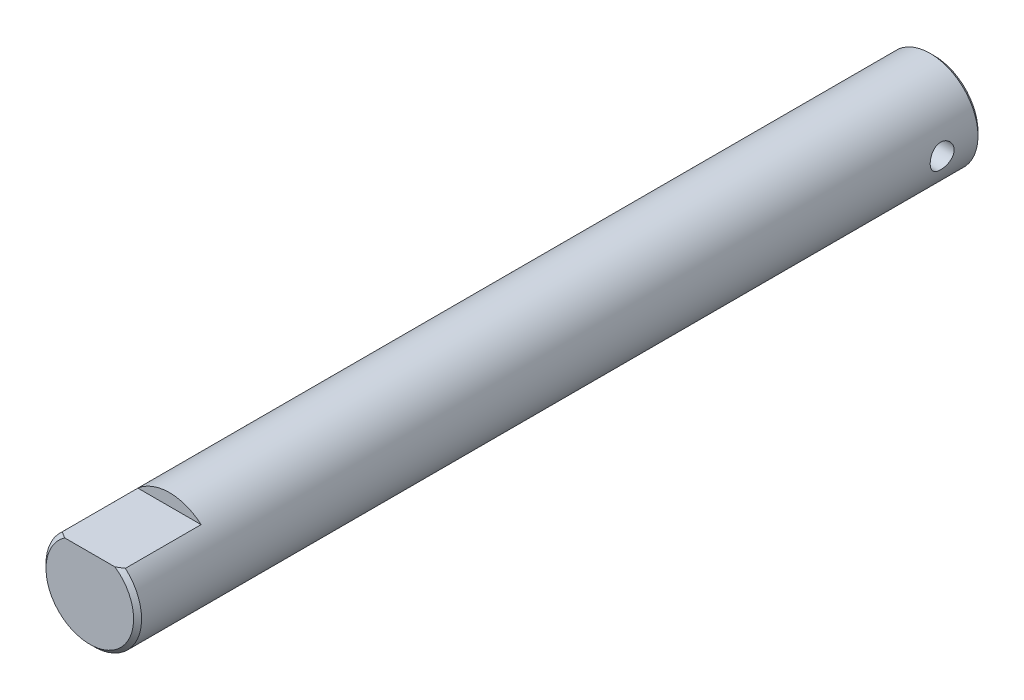
ISO-10303-21;
HEADER;
FILE_DESCRIPTION(('STEP AP214'),'2;1');
FILE_NAME('part.step','',(''),(''),'','','');
FILE_SCHEMA(('AUTOMOTIVE_DESIGN { 1 0 10303 214 1 1 1 1 }'));
ENDSEC;
DATA;
#1=APPLICATION_CONTEXT('core data for automotive mechanical design processes');
#2=APPLICATION_PROTOCOL_DEFINITION('international standard','automotive_design',2000,#1);
#3=PRODUCT_CONTEXT('',#1,'mechanical');
#4=PRODUCT('Part','Part','',(#3));
#5=PRODUCT_RELATED_PRODUCT_CATEGORY('part','',(#4));
#6=PRODUCT_DEFINITION_FORMATION('','',#4);
#7=PRODUCT_DEFINITION_CONTEXT('part definition',#1,'design');
#8=PRODUCT_DEFINITION('design','',#6,#7);
#9=PRODUCT_DEFINITION_SHAPE('','',#8);
#10=(LENGTH_UNIT() NAMED_UNIT(*) SI_UNIT(.MILLI.,.METRE.));
#11=(NAMED_UNIT(*) PLANE_ANGLE_UNIT() SI_UNIT($,.RADIAN.));
#12=(NAMED_UNIT(*) SI_UNIT($,.STERADIAN.) SOLID_ANGLE_UNIT());
#13=UNCERTAINTY_MEASURE_WITH_UNIT(LENGTH_MEASURE(1.E-05),#10,'distance_accuracy_value','');
#14=(GEOMETRIC_REPRESENTATION_CONTEXT(3) GLOBAL_UNCERTAINTY_ASSIGNED_CONTEXT((#13)) GLOBAL_UNIT_ASSIGNED_CONTEXT((#10,
#11,#12)) REPRESENTATION_CONTEXT('',''));
#15=CARTESIAN_POINT('',(0.,0.,0.));
#16=DIRECTION('',(0.,0.,1.));
#17=DIRECTION('',(1.,0.,0.));
#18=AXIS2_PLACEMENT_3D('',#15,#16,#17);
#19=CARTESIAN_POINT('',(0.,0.,53.));
#20=DIRECTION('',(0.,0.,-1.));
#21=DIRECTION('',(-1.,0.,0.));
#22=AXIS2_PLACEMENT_3D('',#19,#20,#21);
#23=CYLINDRICAL_SURFACE('',#22,6.);
#24=CARTESIAN_POINT('',(0.,0.,-52.5));
#25=DIRECTION('',(0.,0.,1.));
#26=DIRECTION('',(1.,0.,0.));
#27=AXIS2_PLACEMENT_3D('',#24,#25,#26);
#28=CIRCLE('',#27,6.);
#29=CARTESIAN_POINT('',(6.,0.,-52.5));
#30=VERTEX_POINT('',#29);
#31=EDGE_CURVE('E89',#30,#30,#28,.T.);
#32=ORIENTED_EDGE('',*,*,#31,.T.);
#33=EDGE_LOOP('',(#32));
#34=FACE_BOUND('',#33,.T.);
#35=CARTESIAN_POINT('',(6.,0.,-49.5));
#36=CARTESIAN_POINT('',(5.99999859868012,-0.0828760886697312,-49.4999976742618));
#37=CARTESIAN_POINT('',(5.99826578131828,-0.165778157830764,-49.4931084492262));
#38=CARTESIAN_POINT('',(5.99152113829892,-0.329206323770533,-49.465774848693));
#39=CARTESIAN_POINT('',(5.98650745419969,-0.40973104687074,-49.4453227904622));
#40=CARTESIAN_POINT('',(5.9737562633204,-0.566020872182577,-49.3915607465379));
#41=CARTESIAN_POINT('',(5.96602202842087,-0.641791563430002,-49.3582662012847));
#42=CARTESIAN_POINT('',(5.94865343807593,-0.786672131904427,-49.2798186099552));
#43=CARTESIAN_POINT('',(5.9390190185405,-0.855781784348762,-49.2346651638811));
#44=CARTESIAN_POINT('',(5.91867413591801,-0.986801927300924,-49.1327992103458));
#45=CARTESIAN_POINT('',(5.90794707148533,-1.04855569006108,-49.0758884250408));
#46=CARTESIAN_POINT('',(5.88673620117529,-1.16174892720331,-48.9525477950911));
#47=CARTESIAN_POINT('',(5.87625242288348,-1.21318723694914,-48.8861168770535));
#48=CARTESIAN_POINT('',(5.8565477569971,-1.30502654279904,-48.7444047732626));
#49=CARTESIAN_POINT('',(5.84734794470605,-1.34525221592536,-48.6690067691896));
#50=CARTESIAN_POINT('',(5.83149494812223,-1.41239690855053,-48.5122515883416));
#51=CARTESIAN_POINT('',(5.82484135672789,-1.43931805543934,-48.4308953666742));
#52=CARTESIAN_POINT('',(5.81500476717551,-1.47855483680429,-48.2662565017975));
#53=CARTESIAN_POINT('',(5.81175491075426,-1.49115226833334,-48.1830451039502));
#54=CARTESIAN_POINT('',(5.80889362537741,-1.50226177506786,-48.015631430986));
#55=CARTESIAN_POINT('',(5.80928160448644,-1.50077614181798,-47.9314293193014));
#56=CARTESIAN_POINT('',(5.81359205496618,-1.48398652463928,-47.7665841922555));
#57=CARTESIAN_POINT('',(5.81742863001879,-1.46901834019052,-47.6859043785349));
#58=CARTESIAN_POINT('',(5.82806709676484,-1.42622418690311,-47.5282389490887));
#59=CARTESIAN_POINT('',(5.83486919970696,-1.39839730206943,-47.451253596971));
#60=CARTESIAN_POINT('',(5.85075113904186,-1.33038947793716,-47.3022619837479));
#61=CARTESIAN_POINT('',(5.85985327469421,-1.29008666723292,-47.2303138282105));
#62=CARTESIAN_POINT('',(5.87929710846386,-1.19835627601496,-47.0940812902432));
#63=CARTESIAN_POINT('',(5.88963902334735,-1.14692674880884,-47.0297982519327));
#64=CARTESIAN_POINT('',(5.91075880539781,-1.03266342468122,-46.9087963843056));
#65=CARTESIAN_POINT('',(5.92154069477971,-0.969546258165861,-46.8523455099387));
#66=CARTESIAN_POINT('',(5.94205965578786,-0.834611917503703,-46.7507787575361));
#67=CARTESIAN_POINT('',(5.95179669549415,-0.762794477707949,-46.7056632257364));
#68=CARTESIAN_POINT('',(5.96917732094182,-0.612115888681399,-46.6279494137756));
#69=CARTESIAN_POINT('',(5.97681360127725,-0.53323139320863,-46.5953946597456));
#70=CARTESIAN_POINT('',(5.98907916991419,-0.370876008142887,-46.5440826942904));
#71=CARTESIAN_POINT('',(5.99370903339281,-0.287405999150488,-46.5253228435819));
#72=CARTESIAN_POINT('',(5.99935499271375,-0.120539970390028,-46.5025424344412));
#73=CARTESIAN_POINT('',(6.00046053508279,-0.0371967199882105,-46.4981569739247));
#74=CARTESIAN_POINT('',(5.99918804814451,0.129032874801508,-46.5032490020555));
#75=CARTESIAN_POINT('',(5.99681033241847,0.211919259644595,-46.5127252427991));
#76=CARTESIAN_POINT('',(5.98889581127357,0.373614268776493,-46.5449709083914));
#77=CARTESIAN_POINT('',(5.98340634185811,0.452465118968757,-46.567541263477));
#78=CARTESIAN_POINT('',(5.96988706634134,0.605257292452514,-46.6251070840284));
#79=CARTESIAN_POINT('',(5.96185700369892,0.679198119032637,-46.6601038043132));
#80=CARTESIAN_POINT('',(5.9439330792631,0.821523134429848,-46.7422361288747));
#81=CARTESIAN_POINT('',(5.93400867366932,0.889785441835832,-46.7895761123968));
#82=CARTESIAN_POINT('',(5.91344509187419,1.01752661364325,-46.894789908797));
#83=CARTESIAN_POINT('',(5.90280579251705,1.07700395897301,-46.9526655396169));
#84=CARTESIAN_POINT('',(5.88168956960771,1.18699056807273,-47.0790019608445));
#85=CARTESIAN_POINT('',(5.87122304187281,1.23724386762204,-47.1476877030024));
#86=CARTESIAN_POINT('',(5.85192878377239,1.3255107590127,-47.2927326344657));
#87=CARTESIAN_POINT('',(5.84310098067026,1.36352489415794,-47.3690914829598));
#88=CARTESIAN_POINT('',(5.82818094734665,1.4259514206093,-47.5269057224131));
#89=CARTESIAN_POINT('',(5.82207255291906,1.45044439665407,-47.608327628344));
#90=CARTESIAN_POINT('',(5.81326744090183,1.48534565995378,-47.7743096378891));
#91=CARTESIAN_POINT('',(5.81056997719936,1.49575702747866,-47.8588690510325));
#92=CARTESIAN_POINT('',(5.80894901203957,1.502038590334,-48.0261210238552));
#93=CARTESIAN_POINT('',(5.80991932728264,1.49831789778012,-48.1087974351247));
#94=CARTESIAN_POINT('',(5.81527909007843,1.47737727831287,-48.272303888668));
#95=CARTESIAN_POINT('',(5.81966846891857,1.46015762268677,-48.3531339680137));
#96=CARTESIAN_POINT('',(5.83131260682722,1.4129313194428,-48.5102084590654));
#97=CARTESIAN_POINT('',(5.83855015236309,1.38300140468038,-48.5864773052402));
#98=CARTESIAN_POINT('',(5.85507755724828,1.31126491360508,-48.7329653827137));
#99=CARTESIAN_POINT('',(5.86436770120773,1.26945669003419,-48.8031837731869));
#100=CARTESIAN_POINT('',(5.88425634263512,1.17386774863714,-48.937554629002));
#101=CARTESIAN_POINT('',(5.89488264831757,1.11980316291226,-49.001501073424));
#102=CARTESIAN_POINT('',(5.91608027246286,1.00178937118974,-49.1195470447954));
#103=CARTESIAN_POINT('',(5.9266515772706,0.937837821261149,-49.173644230113));
#104=CARTESIAN_POINT('',(5.94677655647663,0.80046758670259,-49.2714113085646));
#105=CARTESIAN_POINT('',(5.95630833365868,0.726898422316386,-49.3148746136716));
#106=CARTESIAN_POINT('',(5.97304924975118,0.573266059510476,-49.3887474629405));
#107=CARTESIAN_POINT('',(5.98026005199781,0.493207563436741,-49.4191663606485));
#108=CARTESIAN_POINT('',(5.99048059565542,0.344410253243474,-49.4615718303297));
#109=CARTESIAN_POINT('',(5.99402585052691,0.27638017090807,-49.4759512430534));
#110=CARTESIAN_POINT('',(5.99878605231948,0.138906071536284,-49.4951659436219));
#111=CARTESIAN_POINT('',(6.00000117450894,0.0694621612426167,-49.5000019493053));
#112=CARTESIAN_POINT('',(6.,0.,-49.5));
#113=B_SPLINE_CURVE_WITH_KNOTS('',3,(#35,#36,#37,#38,#39,#40,#41,#42,#43,#44,#45,#46,#47,#48,
#49,#50,#51,#52,#53,#54,#55,#56,#57,#58,#59,#60,#61,#62,#63,#64,#65,#66,#67,#68,#69,#70,#71,#72,
#73,#74,#75,#76,#77,#78,#79,#80,#81,#82,#83,#84,#85,#86,#87,#88,#89,#90,#91,#92,#93,#94,#95,#96,
#97,#98,#99,#100,#101,#102,#103,#104,#105,#106,#107,#108,#109,#110,#111,#112),.UNSPECIFIED.,.T.,
.F.,(4,2,2,2,2,2,2,2,2,2,2,2,2,2,2,2,2,2,2,2,2,2,2,2,2,2,2,2,2,2,2,2,2,2,2,2,2,2,4),(0.,
0.24837371247189,0.496888237763901,0.745104902286104,0.99332994016933,1.24614435437139,
1.49898729580062,1.75558647545807,2.01214461169369,2.2635629509943,2.51494038112697,
2.76022497007018,3.00552703466038,3.25330527873879,3.50112690836164,3.7560150096902,
4.01091089558247,4.26668229009114,4.52240473688644,4.77158308949277,5.02073901112744,
5.26620274514039,5.51169127322292,5.76153587565353,6.0114236300802,6.26744509204477,
6.5234551874951,6.77792254614039,7.0323342325241,7.27943780398614,7.52653640956036,
7.77216400559449,8.01782568136903,8.26989576409912,8.5220256977042,8.7787218549959,
9.03523363821352,9.24342242942151,9.45159556043042),.UNSPECIFIED.);
#114=CARTESIAN_POINT('',(6.,0.,-49.5));
#115=VERTEX_POINT('',#114);
#116=EDGE_CURVE('E98',#115,#115,#113,.T.);
#117=ORIENTED_EDGE('',*,*,#116,.T.);
#118=EDGE_LOOP('',(#117));
#119=FACE_BOUND('',#118,.T.);
#120=CARTESIAN_POINT('',(-6.,0.,-49.5));
#121=CARTESIAN_POINT('',(-5.99999859868013,0.0828760886697312,-49.4999976742618));
#122=CARTESIAN_POINT('',(-5.99826578131828,0.165778157830763,-49.4931084492262));
#123=CARTESIAN_POINT('',(-5.99152113829892,0.329206323770533,-49.465774848693));
#124=CARTESIAN_POINT('',(-5.98650745419968,0.40973104687074,-49.4453227904622));
#125=CARTESIAN_POINT('',(-5.9737562633204,0.566020872182577,-49.3915607465379));
#126=CARTESIAN_POINT('',(-5.96602202842087,0.641791563430002,-49.3582662012847));
#127=CARTESIAN_POINT('',(-5.94865343807593,0.786672131904427,-49.2798186099552));
#128=CARTESIAN_POINT('',(-5.9390190185405,0.855781784348761,-49.2346651638811));
#129=CARTESIAN_POINT('',(-5.91867413591801,0.986801927300925,-49.1327992103458));
#130=CARTESIAN_POINT('',(-5.90794707148533,1.04855569006108,-49.0758884250408));
#131=CARTESIAN_POINT('',(-5.88673620117529,1.16174892720331,-48.9525477950911));
#132=CARTESIAN_POINT('',(-5.87625242288348,1.21318723694914,-48.8861168770535));
#133=CARTESIAN_POINT('',(-5.8565477569971,1.30502654279904,-48.7444047732626));
#134=CARTESIAN_POINT('',(-5.84734794470605,1.34525221592536,-48.6690067691896));
#135=CARTESIAN_POINT('',(-5.83149494812223,1.41239690855053,-48.5122515883416));
#136=CARTESIAN_POINT('',(-5.82484135672789,1.43931805543934,-48.4308953666742));
#137=CARTESIAN_POINT('',(-5.81500476717551,1.47855483680429,-48.2662565017975));
#138=CARTESIAN_POINT('',(-5.81175491075426,1.49115226833334,-48.1830451039502));
#139=CARTESIAN_POINT('',(-5.80889362537741,1.50226177506786,-48.015631430986));
#140=CARTESIAN_POINT('',(-5.80928160448644,1.50077614181798,-47.9314293193014));
#141=CARTESIAN_POINT('',(-5.81359205496618,1.48398652463928,-47.7665841922555));
#142=CARTESIAN_POINT('',(-5.81742863001879,1.46901834019052,-47.6859043785349));
#143=CARTESIAN_POINT('',(-5.82806709676484,1.42622418690311,-47.5282389490887));
#144=CARTESIAN_POINT('',(-5.83486919970696,1.39839730206943,-47.451253596971));
#145=CARTESIAN_POINT('',(-5.85075113904186,1.33038947793716,-47.3022619837479));
#146=CARTESIAN_POINT('',(-5.85985327469421,1.29008666723292,-47.2303138282105));
#147=CARTESIAN_POINT('',(-5.87929710846386,1.19835627601496,-47.0940812902432));
#148=CARTESIAN_POINT('',(-5.88963902334735,1.14692674880884,-47.0297982519327));
#149=CARTESIAN_POINT('',(-5.91075880539781,1.03266342468122,-46.9087963843056));
#150=CARTESIAN_POINT('',(-5.92154069477971,0.969546258165861,-46.8523455099387));
#151=CARTESIAN_POINT('',(-5.94205965578786,0.834611917503703,-46.7507787575361));
#152=CARTESIAN_POINT('',(-5.95179669549415,0.762794477707949,-46.7056632257364));
#153=CARTESIAN_POINT('',(-5.96917732094182,0.612115888681399,-46.6279494137756));
#154=CARTESIAN_POINT('',(-5.97681360127725,0.53323139320863,-46.5953946597456));
#155=CARTESIAN_POINT('',(-5.98907916991419,0.370876008142888,-46.5440826942904));
#156=CARTESIAN_POINT('',(-5.99370903339281,0.287405999150488,-46.5253228435819));
#157=CARTESIAN_POINT('',(-5.99935499271375,0.120539970390028,-46.5025424344412));
#158=CARTESIAN_POINT('',(-6.00046053508279,0.0371967199882107,-46.4981569739247));
#159=CARTESIAN_POINT('',(-5.99918804814451,-0.129032874801507,-46.5032490020555));
#160=CARTESIAN_POINT('',(-5.99681033241847,-0.211919259644594,-46.5127252427991));
#161=CARTESIAN_POINT('',(-5.98889581127357,-0.373614268776493,-46.5449709083914));
#162=CARTESIAN_POINT('',(-5.98340634185811,-0.452465118968757,-46.567541263477));
#163=CARTESIAN_POINT('',(-5.96988706634134,-0.605257292452514,-46.6251070840284));
#164=CARTESIAN_POINT('',(-5.96185700369892,-0.679198119032636,-46.6601038043132));
#165=CARTESIAN_POINT('',(-5.9439330792631,-0.821523134429848,-46.7422361288747));
#166=CARTESIAN_POINT('',(-5.93400867366932,-0.889785441835831,-46.7895761123968));
#167=CARTESIAN_POINT('',(-5.91344509187419,-1.01752661364325,-46.894789908797));
#168=CARTESIAN_POINT('',(-5.90280579251705,-1.07700395897301,-46.9526655396169));
#169=CARTESIAN_POINT('',(-5.88168956960771,-1.18699056807273,-47.0790019608445));
#170=CARTESIAN_POINT('',(-5.87122304187281,-1.23724386762204,-47.1476877030024));
#171=CARTESIAN_POINT('',(-5.85192878377239,-1.3255107590127,-47.2927326344657));
#172=CARTESIAN_POINT('',(-5.84310098067026,-1.36352489415794,-47.3690914829598));
#173=CARTESIAN_POINT('',(-5.82818094734665,-1.4259514206093,-47.5269057224131));
#174=CARTESIAN_POINT('',(-5.82207255291906,-1.45044439665407,-47.608327628344));
#175=CARTESIAN_POINT('',(-5.81326744090183,-1.48534565995378,-47.7743096378891));
#176=CARTESIAN_POINT('',(-5.81056997719936,-1.49575702747866,-47.8588690510325));
#177=CARTESIAN_POINT('',(-5.80894901203957,-1.502038590334,-48.0261210238552));
#178=CARTESIAN_POINT('',(-5.80991932728264,-1.49831789778012,-48.1087974351247));
#179=CARTESIAN_POINT('',(-5.81527909007843,-1.47737727831287,-48.272303888668));
#180=CARTESIAN_POINT('',(-5.81966846891857,-1.46015762268677,-48.3531339680137));
#181=CARTESIAN_POINT('',(-5.83131260682722,-1.4129313194428,-48.5102084590654));
#182=CARTESIAN_POINT('',(-5.83855015236309,-1.38300140468038,-48.5864773052402));
#183=CARTESIAN_POINT('',(-5.85507755724828,-1.31126491360508,-48.7329653827137));
#184=CARTESIAN_POINT('',(-5.86436770120773,-1.26945669003419,-48.8031837731869));
#185=CARTESIAN_POINT('',(-5.88425634263512,-1.17386774863714,-48.937554629002));
#186=CARTESIAN_POINT('',(-5.89488264831757,-1.11980316291226,-49.001501073424));
#187=CARTESIAN_POINT('',(-5.91608027246286,-1.00178937118974,-49.1195470447954));
#188=CARTESIAN_POINT('',(-5.9266515772706,-0.937837821261149,-49.173644230113));
#189=CARTESIAN_POINT('',(-5.94677655647663,-0.80046758670259,-49.2714113085646));
#190=CARTESIAN_POINT('',(-5.95630833365868,-0.726898422316386,-49.3148746136716));
#191=CARTESIAN_POINT('',(-5.97304924975118,-0.573266059510476,-49.3887474629405));
#192=CARTESIAN_POINT('',(-5.98026005199781,-0.493207563436741,-49.4191663606485));
#193=CARTESIAN_POINT('',(-5.99048059565542,-0.344410253243474,-49.4615718303297));
#194=CARTESIAN_POINT('',(-5.99402585052691,-0.27638017090807,-49.4759512430534));
#195=CARTESIAN_POINT('',(-5.99878605231948,-0.138906071536284,-49.4951659436219));
#196=CARTESIAN_POINT('',(-6.00000117450894,-0.0694621612426168,-49.5000019493053));
#197=CARTESIAN_POINT('',(-6.,0.,-49.5));
#198=B_SPLINE_CURVE_WITH_KNOTS('',3,(#120,#121,#122,#123,#124,#125,#126,#127,#128,#129,#130,
#131,#132,#133,#134,#135,#136,#137,#138,#139,#140,#141,#142,#143,#144,#145,#146,#147,#148,#149,
#150,#151,#152,#153,#154,#155,#156,#157,#158,#159,#160,#161,#162,#163,#164,#165,#166,#167,#168,
#169,#170,#171,#172,#173,#174,#175,#176,#177,#178,#179,#180,#181,#182,#183,#184,#185,#186,#187,
#188,#189,#190,#191,#192,#193,#194,#195,#196,#197),.UNSPECIFIED.,.T.,.F.,(4,2,2,2,2,2,2,2,2,2,2,
2,2,2,2,2,2,2,2,2,2,2,2,2,2,2,2,2,2,2,2,2,2,2,2,2,2,2,4),(0.,0.24837371247189,0.496888237763901,
0.745104902286104,0.99332994016933,1.2461443543714,1.49898729580062,1.75558647545807,
2.01214461169369,2.2635629509943,2.51494038112697,2.76022497007018,3.00552703466038,
3.25330527873879,3.50112690836164,3.7560150096902,4.01091089558247,4.26668229009114,
4.52240473688644,4.77158308949277,5.02073901112744,5.26620274514039,5.51169127322292,
5.76153587565353,6.0114236300802,6.26744509204477,6.5234551874951,6.77792254614039,
7.0323342325241,7.27943780398614,7.52653640956036,7.77216400559449,8.01782568136903,
8.26989576409912,8.5220256977042,8.7787218549959,9.03523363821352,9.24342242942151,
9.45159556043042),.UNSPECIFIED.);
#199=CARTESIAN_POINT('',(-6.,0.,-49.5));
#200=VERTEX_POINT('',#199);
#201=EDGE_CURVE('E106',#200,#200,#198,.T.);
#202=ORIENTED_EDGE('',*,*,#201,.T.);
#203=EDGE_LOOP('',(#202));
#204=FACE_BOUND('',#203,.T.);
#205=DIRECTION('',(0.,0.,-1.));
#206=VECTOR('',#205,1.);
#207=CARTESIAN_POINT('',(3.96862696659689,4.5,53.));
#208=LINE('',#207,#206);
#209=CARTESIAN_POINT('',(3.96862696659689,4.5,52.5));
#210=VERTEX_POINT('',#209);
#211=CARTESIAN_POINT('',(3.96862696659689,4.5,43.));
#212=VERTEX_POINT('',#211);
#213=EDGE_CURVE('E71',#210,#212,#208,.T.);
#214=ORIENTED_EDGE('',*,*,#213,.F.);
#215=CARTESIAN_POINT('',(0.,0.,52.5));
#216=DIRECTION('',(0.,0.,1.));
#217=DIRECTION('',(1.,0.,0.));
#218=AXIS2_PLACEMENT_3D('',#215,#216,#217);
#219=CIRCLE('',#218,6.);
#220=CARTESIAN_POINT('',(-3.96862696659689,4.5,52.5));
#221=VERTEX_POINT('',#220);
#222=EDGE_CURVE('E79',#210,#221,#219,.F.);
#223=ORIENTED_EDGE('',*,*,#222,.T.);
#224=DIRECTION('',(0.,0.,-1.));
#225=VECTOR('',#224,1.);
#226=CARTESIAN_POINT('',(-3.96862696659689,4.5,53.));
#227=LINE('',#226,#225);
#228=CARTESIAN_POINT('',(-3.96862696659689,4.5,43.));
#229=VERTEX_POINT('',#228);
#230=EDGE_CURVE('E56',#229,#221,#227,.F.);
#231=ORIENTED_EDGE('',*,*,#230,.F.);
#232=CARTESIAN_POINT('',(0.,0.,43.));
#233=DIRECTION('',(0.,0.,1.));
#234=DIRECTION('',(1.,0.,0.));
#235=AXIS2_PLACEMENT_3D('',#232,#233,#234);
#236=CIRCLE('',#235,6.);
#237=EDGE_CURVE('E11',#212,#229,#236,.T.);
#238=ORIENTED_EDGE('',*,*,#237,.F.);
#239=EDGE_LOOP('',(#214,#223,#231,#238));
#240=FACE_BOUND('',#239,.T.);
#241=ADVANCED_FACE('F39',(#34,#119,#204,#240),#23,.T.);
#242=CARTESIAN_POINT('',(0.,0.,53.));
#243=DIRECTION('',(0.,0.,1.));
#244=DIRECTION('',(1.,0.,0.));
#245=AXIS2_PLACEMENT_3D('',#242,#243,#244);
#246=PLANE('',#245);
#247=CARTESIAN_POINT('',(0.,0.,53.));
#248=DIRECTION('',(0.,0.,1.));
#249=DIRECTION('',(1.,0.,0.));
#250=AXIS2_PLACEMENT_3D('',#247,#248,#249);
#251=CIRCLE('',#250,5.50000000000003);
#252=CARTESIAN_POINT('',(-3.16227766016844,4.5,53.));
#253=VERTEX_POINT('',#252);
#254=CARTESIAN_POINT('',(3.16227766016844,4.5,53.));
#255=VERTEX_POINT('',#254);
#256=EDGE_CURVE('E95',#253,#255,#251,.T.);
#257=ORIENTED_EDGE('',*,*,#256,.T.);
#258=DIRECTION('',(1.,0.,0.));
#259=VECTOR('',#258,1.);
#260=CARTESIAN_POINT('',(6.95206028660199,4.5,53.));
#261=LINE('',#260,#259);
#262=EDGE_CURVE('E83',#253,#255,#261,.T.);
#263=ORIENTED_EDGE('',*,*,#262,.F.);
#264=EDGE_LOOP('',(#257,#263));
#265=FACE_BOUND('',#264,.T.);
#266=ADVANCED_FACE('F120',(#265),#246,.T.);
#267=CARTESIAN_POINT('',(0.,0.,53.));
#268=DIRECTION('',(0.,0.,-1.));
#269=DIRECTION('',(-1.,0.,0.));
#270=AXIS2_PLACEMENT_3D('',#267,#268,#269);
#271=CONICAL_SURFACE('',#270,5.50000000000003,0.785398163397451);
#272=ORIENTED_EDGE('',*,*,#222,.F.);
#273=CARTESIAN_POINT('',(3.96968518776993,4.5,52.4993));
#274=CARTESIAN_POINT('',(3.87339264212717,4.5,52.5629900100431));
#275=CARTESIAN_POINT('',(3.77650441507858,4.5,52.6257923268432));
#276=CARTESIAN_POINT('',(3.58137101964479,4.5,52.7493063449295));
#277=CARTESIAN_POINT('',(3.48312550860662,4.5,52.8100175042624));
#278=CARTESIAN_POINT('',(3.28464161125408,4.5,52.9293132589008));
#279=CARTESIAN_POINT('',(3.18439546930276,4.5,52.9878850137089));
#280=CARTESIAN_POINT('',(2.9822758885838,4.5,53.1021271020675));
#281=CARTESIAN_POINT('',(2.88040255787624,4.5,53.157797627248));
#282=CARTESIAN_POINT('',(2.56614314186694,4.5,53.3228779524289));
#283=CARTESIAN_POINT('',(2.35083682891524,4.5,53.4268472716601));
#284=CARTESIAN_POINT('',(1.91191588938557,4.5,53.6146859790169));
#285=CARTESIAN_POINT('',(1.68832032192072,4.5,53.6985985288842));
#286=CARTESIAN_POINT('',(1.32682203176173,4.5,53.8101921580962));
#287=CARTESIAN_POINT('',(1.19167293079571,4.5,53.8467831231787));
#288=CARTESIAN_POINT('',(0.918838291994893,4.5,53.9090696679195));
#289=CARTESIAN_POINT('',(0.78115267543477,4.5,53.9347649088131));
#290=CARTESIAN_POINT('',(0.505686776709187,4.5,53.9737031637243));
#291=CARTESIAN_POINT('',(0.367927305666231,4.5,53.9870913755016));
#292=CARTESIAN_POINT('',(0.0917592093995372,4.5,54.0011767326336));
#293=CARTESIAN_POINT('',(-0.0466493674345589,4.5,54.0018748094316));
#294=CARTESIAN_POINT('',(-0.323024452129218,4.5,53.9905362391385));
#295=CARTESIAN_POINT('',(-0.460990616515549,4.5,53.9784913623029));
#296=CARTESIAN_POINT('',(-0.735324495961123,4.5,53.9423473413855));
#297=CARTESIAN_POINT('',(-0.871692023903404,4.5,53.9182468003507));
#298=CARTESIAN_POINT('',(-1.14362252943246,4.5,53.8588745829242));
#299=CARTESIAN_POINT('',(-1.27915717091637,4.5,53.8234748266218));
#300=CARTESIAN_POINT('',(-1.54732429372727,4.5,53.7431271923224));
#301=CARTESIAN_POINT('',(-1.67995678272885,4.5,53.6981793395783));
#302=CARTESIAN_POINT('',(-2.00507503766927,4.5,53.576799586627));
#303=CARTESIAN_POINT('',(-2.19577611276913,4.5,53.4956036857894));
#304=CARTESIAN_POINT('',(-2.57108474811657,4.5,53.3199492309929));
#305=CARTESIAN_POINT('',(-2.75568555310647,4.5,53.2254765450112));
#306=CARTESIAN_POINT('',(-3.11446237166683,4.5,53.0293562287011));
#307=CARTESIAN_POINT('',(-3.28878541271186,4.5,52.9279753132057));
#308=CARTESIAN_POINT('',(-3.54674167901104,4.5,52.7707098765538));
#309=CARTESIAN_POINT('',(-3.63202566750237,4.5,52.7174981240359));
#310=CARTESIAN_POINT('',(-3.80158459380831,4.5,52.6095176168777));
#311=CARTESIAN_POINT('',(-3.88585968471076,4.5,52.5547491028239));
#312=CARTESIAN_POINT('',(-3.96968518777061,4.5,52.4992999999996));
#313=B_SPLINE_CURVE_WITH_KNOTS('',3,(#273,#274,#275,#276,#277,#278,#279,#280,#281,#282,#283,
#284,#285,#286,#287,#288,#289,#290,#291,#292,#293,#294,#295,#296,#297,#298,#299,#300,#301,#302,
#303,#304,#305,#306,#307,#308,#309,#310,#311,#312),.UNSPECIFIED.,.F.,.F.,(4,2,2,2,2,2,2,2,2,2,2,
2,2,2,2,2,2,2,2,4),(0.,0.346354756881321,0.692798611306202,1.04106163248061,1.38930162120576,
2.10587648536806,2.82089512487661,3.24056561164749,3.66024914566307,4.07491522819878,
4.48955087453125,4.90445446735072,5.31940614836466,5.73923924226644,6.15907122580604,
6.7801468030268,7.40188854186468,8.00663509482335,8.30819079976117,8.60970015206795),.UNSPECIFIED.);
#314=EDGE_CURVE('E49',#210,#255,#313,.T.);
#315=ORIENTED_EDGE('',*,*,#314,.T.);
#316=ORIENTED_EDGE('',*,*,#256,.F.);
#317=EDGE_CURVE('E144',#253,#221,#313,.T.);
#318=ORIENTED_EDGE('',*,*,#317,.T.);
#319=EDGE_LOOP('',(#272,#315,#316,#318));
#320=FACE_BOUND('',#319,.T.);
#321=ADVANCED_FACE('F42',(#320),#271,.T.);
#322=CARTESIAN_POINT('',(0.,0.,-53.));
#323=DIRECTION('',(0.,0.,1.));
#324=DIRECTION('',(1.,0.,0.));
#325=AXIS2_PLACEMENT_3D('',#322,#323,#324);
#326=PLANE('',#325);
#327=CARTESIAN_POINT('',(0.,0.,-53.));
#328=DIRECTION('',(0.,0.,1.));
#329=DIRECTION('',(1.,0.,0.));
#330=AXIS2_PLACEMENT_3D('',#327,#328,#329);
#331=CIRCLE('',#330,5.50000000000003);
#332=CARTESIAN_POINT('',(5.50000000000003,0.,-53.));
#333=VERTEX_POINT('',#332);
#334=EDGE_CURVE('E92',#333,#333,#331,.F.);
#335=ORIENTED_EDGE('',*,*,#334,.T.);
#336=EDGE_LOOP('',(#335));
#337=FACE_BOUND('',#336,.T.);
#338=ADVANCED_FACE('F124',(#337),#326,.F.);
#339=CARTESIAN_POINT('',(0.,0.,-52.5));
#340=DIRECTION('',(0.,0.,1.));
#341=DIRECTION('',(1.,0.,0.));
#342=AXIS2_PLACEMENT_3D('',#339,#340,#341);
#343=CONICAL_SURFACE('',#342,6.,0.785398163397444);
#344=ORIENTED_EDGE('',*,*,#334,.F.);
#345=EDGE_LOOP('',(#344));
#346=FACE_BOUND('',#345,.T.);
#347=ORIENTED_EDGE('',*,*,#31,.F.);
#348=EDGE_LOOP('',(#347));
#349=FACE_BOUND('',#348,.T.);
#350=ADVANCED_FACE('F117',(#346,#349),#343,.T.);
#351=CARTESIAN_POINT('',(-6.,0.,-48.));
#352=DIRECTION('',(1.,0.,0.));
#353=DIRECTION('',(0.,0.,-1.));
#354=AXIS2_PLACEMENT_3D('',#351,#352,#353);
#355=CYLINDRICAL_SURFACE('',#354,1.5);
#356=ORIENTED_EDGE('',*,*,#116,.F.);
#357=EDGE_LOOP('',(#356));
#358=FACE_BOUND('',#357,.T.);
#359=ORIENTED_EDGE('',*,*,#201,.F.);
#360=EDGE_LOOP('',(#359));
#361=FACE_BOUND('',#360,.T.);
#362=ADVANCED_FACE('F112',(#358,#361),#355,.F.);
#363=CARTESIAN_POINT('',(6.95206028660199,14.5,43.));
#364=DIRECTION('',(0.,0.,1.));
#365=DIRECTION('',(1.,0.,0.));
#366=AXIS2_PLACEMENT_3D('',#363,#364,#365);
#367=PLANE('',#366);
#368=ORIENTED_EDGE('',*,*,#237,.T.);
#369=DIRECTION('',(-1.,0.,0.));
#370=VECTOR('',#369,1.);
#371=CARTESIAN_POINT('',(6.95206028660199,4.5,43.));
#372=LINE('',#371,#370);
#373=EDGE_CURVE('E74',#212,#229,#372,.T.);
#374=ORIENTED_EDGE('',*,*,#373,.F.);
#375=EDGE_LOOP('',(#368,#374));
#376=FACE_BOUND('',#375,.T.);
#377=ADVANCED_FACE('F82',(#376),#367,.T.);
#378=CARTESIAN_POINT('',(0.,4.5,0.));
#379=DIRECTION('',(0.,1.,0.));
#380=DIRECTION('',(0.,0.,1.));
#381=AXIS2_PLACEMENT_3D('',#378,#379,#380);
#382=PLANE('',#381);
#383=ORIENTED_EDGE('',*,*,#213,.T.);
#384=ORIENTED_EDGE('',*,*,#373,.T.);
#385=ORIENTED_EDGE('',*,*,#230,.T.);
#386=ORIENTED_EDGE('',*,*,#317,.F.);
#387=ORIENTED_EDGE('',*,*,#262,.T.);
#388=ORIENTED_EDGE('',*,*,#314,.F.);
#389=EDGE_LOOP('',(#383,#384,#385,#386,#387,#388));
#390=FACE_BOUND('',#389,.T.);
#391=ADVANCED_FACE('F73',(#390),#382,.T.);
#392=CLOSED_SHELL('',(#241,#266,#321,#338,#350,#362,#377,#391));
#393=MANIFOLD_SOLID_BREP('B2',#392);
#394=ADVANCED_BREP_SHAPE_REPRESENTATION('',(#18,#393),#14);
#395=SHAPE_DEFINITION_REPRESENTATION(#9,#394);
ENDSEC;
END-ISO-10303-21;
